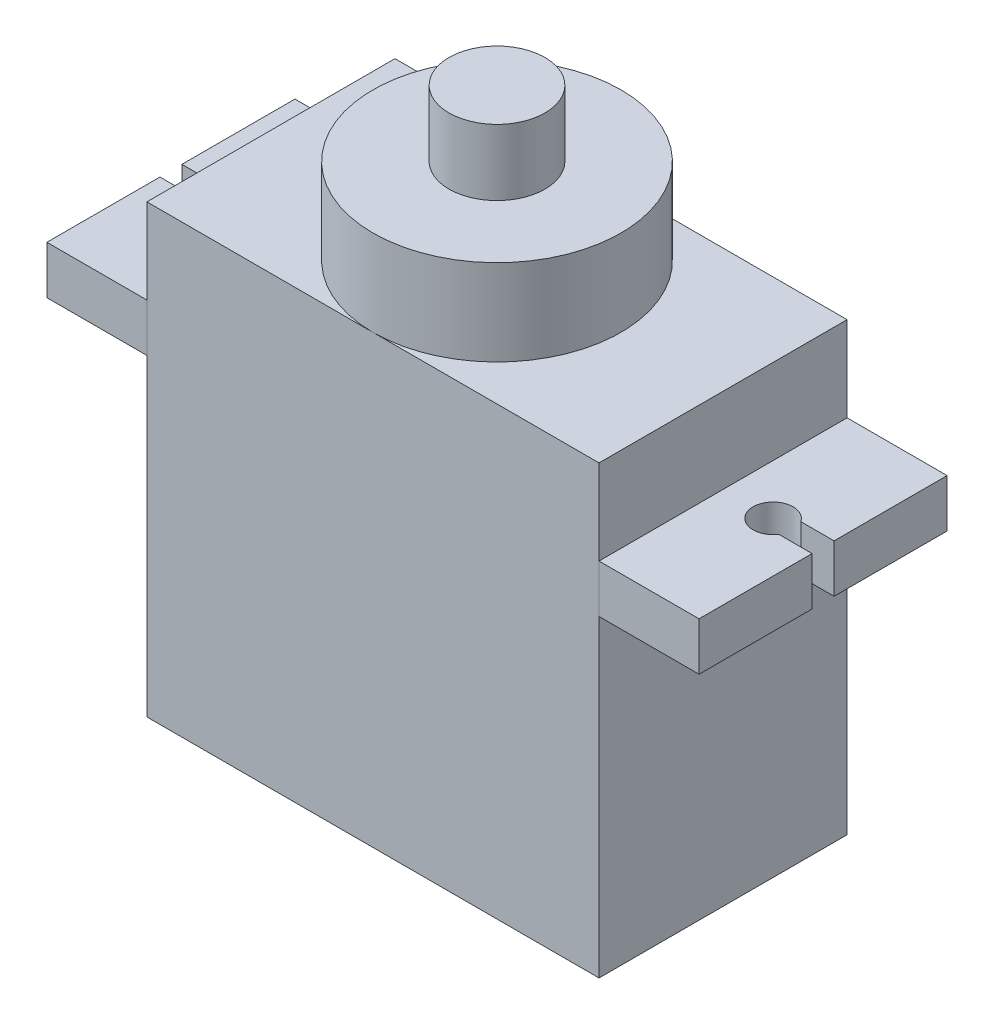
ISO-10303-21;
HEADER;
FILE_DESCRIPTION(('STEP AP214'),'2;1');
FILE_NAME('part.step','',(''),(''),'','','');
FILE_SCHEMA(('AUTOMOTIVE_DESIGN { 1 0 10303 214 1 1 1 1 }'));
ENDSEC;
DATA;
#1=APPLICATION_CONTEXT('core data for automotive mechanical design processes');
#2=APPLICATION_PROTOCOL_DEFINITION('international standard','automotive_design',2000,#1);
#3=PRODUCT_CONTEXT('',#1,'mechanical');
#4=PRODUCT('Part','Part','',(#3));
#5=PRODUCT_RELATED_PRODUCT_CATEGORY('part','',(#4));
#6=PRODUCT_DEFINITION_FORMATION('','',#4);
#7=PRODUCT_DEFINITION_CONTEXT('part definition',#1,'design');
#8=PRODUCT_DEFINITION('design','',#6,#7);
#9=PRODUCT_DEFINITION_SHAPE('','',#8);
#10=(LENGTH_UNIT() NAMED_UNIT(*) SI_UNIT(.MILLI.,.METRE.));
#11=(NAMED_UNIT(*) PLANE_ANGLE_UNIT() SI_UNIT($,.RADIAN.));
#12=(NAMED_UNIT(*) SI_UNIT($,.STERADIAN.) SOLID_ANGLE_UNIT());
#13=UNCERTAINTY_MEASURE_WITH_UNIT(LENGTH_MEASURE(1.E-05),#10,'distance_accuracy_value','');
#14=(GEOMETRIC_REPRESENTATION_CONTEXT(3) GLOBAL_UNCERTAINTY_ASSIGNED_CONTEXT((#13)) GLOBAL_UNIT_ASSIGNED_CONTEXT((#10,
#11,#12)) REPRESENTATION_CONTEXT('',''));
#15=CARTESIAN_POINT('',(0.,0.,0.));
#16=DIRECTION('',(0.,0.,1.));
#17=DIRECTION('',(1.,0.,0.));
#18=AXIS2_PLACEMENT_3D('',#15,#16,#17);
#19=CARTESIAN_POINT('',(-16.3,18.05,-6.2));
#20=DIRECTION('',(-1.,0.,0.));
#21=DIRECTION('',(0.,0.,1.));
#22=AXIS2_PLACEMENT_3D('',#19,#20,#21);
#23=PLANE('',#22);
#24=DIRECTION('',(0.,1.,0.));
#25=VECTOR('',#24,1.);
#26=CARTESIAN_POINT('',(-16.3,0.,0.550000000000012));
#27=LINE('',#26,#25);
#28=CARTESIAN_POINT('',(-16.3,15.65,0.550000000000012));
#29=VERTEX_POINT('',#28);
#30=CARTESIAN_POINT('',(-16.3,18.05,0.550000000000012));
#31=VERTEX_POINT('',#30);
#32=EDGE_CURVE('E148',#29,#31,#27,.T.);
#33=ORIENTED_EDGE('',*,*,#32,.F.);
#34=DIRECTION('',(0.,0.,1.));
#35=VECTOR('',#34,1.);
#36=CARTESIAN_POINT('',(-16.3,15.65,-6.2));
#37=LINE('',#36,#35);
#38=CARTESIAN_POINT('',(-16.3,15.65,6.2));
#39=VERTEX_POINT('',#38);
#40=EDGE_CURVE('E153',#29,#39,#37,.T.);
#41=ORIENTED_EDGE('',*,*,#40,.T.);
#42=DIRECTION('',(0.,-1.,0.));
#43=VECTOR('',#42,1.);
#44=CARTESIAN_POINT('',(-16.3,18.05,6.2));
#45=LINE('',#44,#43);
#46=CARTESIAN_POINT('',(-16.3,18.05,6.2));
#47=VERTEX_POINT('',#46);
#48=EDGE_CURVE('E161',#47,#39,#45,.T.);
#49=ORIENTED_EDGE('',*,*,#48,.F.);
#50=DIRECTION('',(0.,0.,1.));
#51=VECTOR('',#50,1.);
#52=CARTESIAN_POINT('',(-16.3,18.05,-6.2));
#53=LINE('',#52,#51);
#54=EDGE_CURVE('E154',#31,#47,#53,.T.);
#55=ORIENTED_EDGE('',*,*,#54,.F.);
#56=EDGE_LOOP('',(#33,#41,#49,#55));
#57=FACE_BOUND('',#56,.T.);
#58=ADVANCED_FACE('F60',(#57),#23,.T.);
#59=CARTESIAN_POINT('',(-11.3,18.05,-6.2));
#60=DIRECTION('',(1.,0.,0.));
#61=DIRECTION('',(0.,0.,-1.));
#62=AXIS2_PLACEMENT_3D('',#59,#60,#61);
#63=PLANE('',#62);
#64=DIRECTION('',(0.,1.,0.));
#65=VECTOR('',#64,1.);
#66=CARTESIAN_POINT('',(-11.3,18.05,6.2));
#67=LINE('',#66,#65);
#68=CARTESIAN_POINT('',(-11.3,15.65,6.2));
#69=VERTEX_POINT('',#68);
#70=CARTESIAN_POINT('',(-11.3,18.05,6.2));
#71=VERTEX_POINT('',#70);
#72=EDGE_CURVE('E167',#69,#71,#67,.T.);
#73=ORIENTED_EDGE('',*,*,#72,.F.);
#74=DIRECTION('',(0.,0.,1.));
#75=VECTOR('',#74,1.);
#76=CARTESIAN_POINT('',(-11.3,15.65,-6.2));
#77=LINE('',#76,#75);
#78=CARTESIAN_POINT('',(-11.3,15.65,-6.2));
#79=VERTEX_POINT('',#78);
#80=EDGE_CURVE('E12',#79,#69,#77,.T.);
#81=ORIENTED_EDGE('',*,*,#80,.F.);
#82=DIRECTION('',(0.,1.,0.));
#83=VECTOR('',#82,1.);
#84=CARTESIAN_POINT('',(-11.3,18.05,-6.2));
#85=LINE('',#84,#83);
#86=CARTESIAN_POINT('',(-11.3,18.05,-6.2));
#87=VERTEX_POINT('',#86);
#88=EDGE_CURVE('E160',#79,#87,#85,.T.);
#89=ORIENTED_EDGE('',*,*,#88,.T.);
#90=DIRECTION('',(0.,0.,1.));
#91=VECTOR('',#90,1.);
#92=CARTESIAN_POINT('',(-11.3,18.05,-6.2));
#93=LINE('',#92,#91);
#94=EDGE_CURVE('E64',#87,#71,#93,.T.);
#95=ORIENTED_EDGE('',*,*,#94,.T.);
#96=EDGE_LOOP('',(#73,#81,#89,#95));
#97=FACE_BOUND('',#96,.T.);
#98=ADVANCED_FACE('F62',(#97),#63,.T.);
#99=CARTESIAN_POINT('',(-11.3,15.65,-6.2));
#100=DIRECTION('',(0.,-1.,0.));
#101=DIRECTION('',(0.,0.,-1.));
#102=AXIS2_PLACEMENT_3D('',#99,#100,#101);
#103=PLANE('',#102);
#104=DIRECTION('',(-1.,0.,0.));
#105=VECTOR('',#104,1.);
#106=CARTESIAN_POINT('',(-11.3,15.65,0.55000000000001));
#107=LINE('',#106,#105);
#108=CARTESIAN_POINT('',(-14.6351646544245,15.65,0.550000000000011));
#109=VERTEX_POINT('',#108);
#110=EDGE_CURVE('E178',#109,#29,#107,.T.);
#111=ORIENTED_EDGE('',*,*,#110,.F.);
#112=CARTESIAN_POINT('',(-13.8,15.65,0.));
#113=DIRECTION('',(0.,-1.,0.));
#114=DIRECTION('',(0.,0.,-1.));
#115=AXIS2_PLACEMENT_3D('',#112,#113,#114);
#116=CIRCLE('',#115,1.);
#117=CARTESIAN_POINT('',(-14.6351646544245,15.65,-0.550000000000004));
#118=VERTEX_POINT('',#117);
#119=EDGE_CURVE('E170',#118,#109,#116,.T.);
#120=ORIENTED_EDGE('',*,*,#119,.F.);
#121=DIRECTION('',(1.,0.,0.));
#122=VECTOR('',#121,1.);
#123=CARTESIAN_POINT('',(-11.3,15.65,-0.550000000000004));
#124=LINE('',#123,#122);
#125=CARTESIAN_POINT('',(-16.3,15.65,-0.550000000000004));
#126=VERTEX_POINT('',#125);
#127=EDGE_CURVE('E180',#126,#118,#124,.T.);
#128=ORIENTED_EDGE('',*,*,#127,.F.);
#129=CARTESIAN_POINT('',(-16.3,15.65,-6.2));
#130=VERTEX_POINT('',#129);
#131=EDGE_CURVE('E69',#130,#126,#37,.T.);
#132=ORIENTED_EDGE('',*,*,#131,.F.);
#133=DIRECTION('',(1.,0.,0.));
#134=VECTOR('',#133,1.);
#135=CARTESIAN_POINT('',(-11.3,15.65,-6.2));
#136=LINE('',#135,#134);
#137=EDGE_CURVE('E171',#130,#79,#136,.T.);
#138=ORIENTED_EDGE('',*,*,#137,.T.);
#139=ORIENTED_EDGE('',*,*,#80,.T.);
#140=DIRECTION('',(1.,0.,0.));
#141=VECTOR('',#140,1.);
#142=CARTESIAN_POINT('',(-11.3,15.65,6.2));
#143=LINE('',#142,#141);
#144=EDGE_CURVE('E157',#39,#69,#143,.T.);
#145=ORIENTED_EDGE('',*,*,#144,.F.);
#146=ORIENTED_EDGE('',*,*,#40,.F.);
#147=EDGE_LOOP('',(#111,#120,#128,#132,#138,#139,#145,#146));
#148=FACE_BOUND('',#147,.T.);
#149=ADVANCED_FACE('F202',(#148),#103,.T.);
#150=DIRECTION('',(0.,1.,0.));
#151=VECTOR('',#150,1.);
#152=CARTESIAN_POINT('',(-16.3,0.,-0.550000000000004));
#153=LINE('',#152,#151);
#154=CARTESIAN_POINT('',(-16.3,18.05,-0.550000000000004));
#155=VERTEX_POINT('',#154);
#156=EDGE_CURVE('E136',#126,#155,#153,.T.);
#157=ORIENTED_EDGE('',*,*,#156,.T.);
#158=CARTESIAN_POINT('',(-16.3,18.05,-6.2));
#159=VERTEX_POINT('',#158);
#160=EDGE_CURVE('E146',#159,#155,#53,.T.);
#161=ORIENTED_EDGE('',*,*,#160,.F.);
#162=DIRECTION('',(0.,-1.,0.));
#163=VECTOR('',#162,1.);
#164=CARTESIAN_POINT('',(-16.3,18.05,-6.2));
#165=LINE('',#164,#163);
#166=EDGE_CURVE('E173',#159,#130,#165,.T.);
#167=ORIENTED_EDGE('',*,*,#166,.T.);
#168=ORIENTED_EDGE('',*,*,#131,.T.);
#169=EDGE_LOOP('',(#157,#161,#167,#168));
#170=FACE_BOUND('',#169,.T.);
#171=ADVANCED_FACE('F144',(#170),#23,.T.);
#172=CARTESIAN_POINT('',(-11.3,18.05,-6.2));
#173=DIRECTION('',(0.,1.,0.));
#174=DIRECTION('',(0.,0.,1.));
#175=AXIS2_PLACEMENT_3D('',#172,#173,#174);
#176=PLANE('',#175);
#177=DIRECTION('',(1.,0.,0.));
#178=VECTOR('',#177,1.);
#179=CARTESIAN_POINT('',(-14.6351646544245,18.05,0.550000000000011));
#180=LINE('',#179,#178);
#181=CARTESIAN_POINT('',(-14.6351646544245,18.05,0.550000000000011));
#182=VERTEX_POINT('',#181);
#183=EDGE_CURVE('E140',#31,#182,#180,.T.);
#184=ORIENTED_EDGE('',*,*,#183,.F.);
#185=ORIENTED_EDGE('',*,*,#54,.T.);
#186=DIRECTION('',(-1.,0.,0.));
#187=VECTOR('',#186,1.);
#188=CARTESIAN_POINT('',(-11.3,18.05,6.2));
#189=LINE('',#188,#187);
#190=EDGE_CURVE('E164',#71,#47,#189,.T.);
#191=ORIENTED_EDGE('',*,*,#190,.F.);
#192=ORIENTED_EDGE('',*,*,#94,.F.);
#193=DIRECTION('',(-1.,0.,0.));
#194=VECTOR('',#193,1.);
#195=CARTESIAN_POINT('',(-11.3,18.05,-6.2));
#196=LINE('',#195,#194);
#197=EDGE_CURVE('E152',#87,#159,#196,.T.);
#198=ORIENTED_EDGE('',*,*,#197,.T.);
#199=ORIENTED_EDGE('',*,*,#160,.T.);
#200=DIRECTION('',(-1.,0.,0.));
#201=VECTOR('',#200,1.);
#202=CARTESIAN_POINT('',(-16.3,18.05,-0.550000000000004));
#203=LINE('',#202,#201);
#204=CARTESIAN_POINT('',(-14.6351646544245,18.05,-0.550000000000004));
#205=VERTEX_POINT('',#204);
#206=EDGE_CURVE('E133',#205,#155,#203,.T.);
#207=ORIENTED_EDGE('',*,*,#206,.F.);
#208=CARTESIAN_POINT('',(-13.8,18.05,0.));
#209=DIRECTION('',(0.,1.,0.));
#210=DIRECTION('',(0.,0.,-1.));
#211=AXIS2_PLACEMENT_3D('',#208,#209,#210);
#212=CIRCLE('',#211,1.);
#213=EDGE_CURVE('E77',#182,#205,#212,.T.);
#214=ORIENTED_EDGE('',*,*,#213,.F.);
#215=EDGE_LOOP('',(#184,#185,#191,#192,#198,#199,#207,#214));
#216=FACE_BOUND('',#215,.T.);
#217=ADVANCED_FACE('F151',(#216),#176,.T.);
#218=CARTESIAN_POINT('',(0.,0.,-6.2));
#219=DIRECTION('',(0.,0.,-1.));
#220=DIRECTION('',(-1.,0.,0.));
#221=AXIS2_PLACEMENT_3D('',#218,#219,#220);
#222=PLANE('',#221);
#223=ORIENTED_EDGE('',*,*,#88,.F.);
#224=ORIENTED_EDGE('',*,*,#137,.F.);
#225=ORIENTED_EDGE('',*,*,#166,.F.);
#226=ORIENTED_EDGE('',*,*,#197,.F.);
#227=EDGE_LOOP('',(#223,#224,#225,#226));
#228=FACE_BOUND('',#227,.T.);
#229=ADVANCED_FACE('F201',(#228),#222,.T.);
#230=CARTESIAN_POINT('',(0.,0.,6.2));
#231=DIRECTION('',(0.,0.,-1.));
#232=DIRECTION('',(-1.,0.,0.));
#233=AXIS2_PLACEMENT_3D('',#230,#231,#232);
#234=PLANE('',#233);
#235=ORIENTED_EDGE('',*,*,#72,.T.);
#236=ORIENTED_EDGE('',*,*,#190,.T.);
#237=ORIENTED_EDGE('',*,*,#48,.T.);
#238=ORIENTED_EDGE('',*,*,#144,.T.);
#239=EDGE_LOOP('',(#235,#236,#237,#238));
#240=FACE_BOUND('',#239,.T.);
#241=ADVANCED_FACE('F198',(#240),#234,.F.);
#242=CARTESIAN_POINT('',(-13.8,0.,0.));
#243=DIRECTION('',(0.,1.,0.));
#244=DIRECTION('',(0.,0.,1.));
#245=AXIS2_PLACEMENT_3D('',#242,#243,#244);
#246=CYLINDRICAL_SURFACE('',#245,1.);
#247=ORIENTED_EDGE('',*,*,#119,.T.);
#248=DIRECTION('',(0.,1.,0.));
#249=VECTOR('',#248,1.);
#250=CARTESIAN_POINT('',(-14.6351646544245,0.,0.550000000000011));
#251=LINE('',#250,#249);
#252=EDGE_CURVE('E182',#109,#182,#251,.T.);
#253=ORIENTED_EDGE('',*,*,#252,.T.);
#254=ORIENTED_EDGE('',*,*,#213,.T.);
#255=DIRECTION('',(0.,1.,0.));
#256=VECTOR('',#255,1.);
#257=CARTESIAN_POINT('',(-14.6351646544245,0.,-0.550000000000004));
#258=LINE('',#257,#256);
#259=EDGE_CURVE('E138',#118,#205,#258,.T.);
#260=ORIENTED_EDGE('',*,*,#259,.F.);
#261=EDGE_LOOP('',(#247,#253,#254,#260));
#262=FACE_BOUND('',#261,.T.);
#263=ADVANCED_FACE('F204',(#262),#246,.F.);
#264=CARTESIAN_POINT('',(-14.6351646544245,0.,0.550000000000011));
#265=DIRECTION('',(0.,0.,1.));
#266=DIRECTION('',(1.,0.,0.));
#267=AXIS2_PLACEMENT_3D('',#264,#265,#266);
#268=PLANE('',#267);
#269=ORIENTED_EDGE('',*,*,#110,.T.);
#270=ORIENTED_EDGE('',*,*,#32,.T.);
#271=ORIENTED_EDGE('',*,*,#183,.T.);
#272=ORIENTED_EDGE('',*,*,#252,.F.);
#273=EDGE_LOOP('',(#269,#270,#271,#272));
#274=FACE_BOUND('',#273,.T.);
#275=ADVANCED_FACE('F190',(#274),#268,.F.);
#276=CARTESIAN_POINT('',(-16.3,0.,-0.550000000000004));
#277=DIRECTION('',(0.,0.,-1.));
#278=DIRECTION('',(-1.,0.,0.));
#279=AXIS2_PLACEMENT_3D('',#276,#277,#278);
#280=PLANE('',#279);
#281=ORIENTED_EDGE('',*,*,#127,.T.);
#282=ORIENTED_EDGE('',*,*,#259,.T.);
#283=ORIENTED_EDGE('',*,*,#206,.T.);
#284=ORIENTED_EDGE('',*,*,#156,.F.);
#285=EDGE_LOOP('',(#281,#282,#283,#284));
#286=FACE_BOUND('',#285,.T.);
#287=ADVANCED_FACE('F135',(#286),#280,.F.);
#288=CLOSED_SHELL('',(#58,#98,#149,#171,#217,#229,#241,#263,#275,#287));
#289=MANIFOLD_SOLID_BREP('B2',#288);
#290=CARTESIAN_POINT('',(16.3,18.05,-6.2));
#291=DIRECTION('',(1.,0.,0.));
#292=DIRECTION('',(0.,0.,-1.));
#293=AXIS2_PLACEMENT_3D('',#290,#291,#292);
#294=PLANE('',#293);
#295=DIRECTION('',(0.,1.,0.));
#296=VECTOR('',#295,1.);
#297=CARTESIAN_POINT('',(16.3,0.,-0.550000000000004));
#298=LINE('',#297,#296);
#299=CARTESIAN_POINT('',(16.3,15.65,-0.550000000000004));
#300=VERTEX_POINT('',#299);
#301=CARTESIAN_POINT('',(16.3,18.05,-0.550000000000004));
#302=VERTEX_POINT('',#301);
#303=EDGE_CURVE('E391',#300,#302,#298,.T.);
#304=ORIENTED_EDGE('',*,*,#303,.F.);
#305=DIRECTION('',(0.,0.,1.));
#306=VECTOR('',#305,1.);
#307=CARTESIAN_POINT('',(16.3,15.65,-6.2));
#308=LINE('',#307,#306);
#309=CARTESIAN_POINT('',(16.3,15.65,-6.2));
#310=VERTEX_POINT('',#309);
#311=EDGE_CURVE('E418',#310,#300,#308,.T.);
#312=ORIENTED_EDGE('',*,*,#311,.F.);
#313=DIRECTION('',(0.,1.,0.));
#314=VECTOR('',#313,1.);
#315=CARTESIAN_POINT('',(16.3,18.05,-6.2));
#316=LINE('',#315,#314);
#317=CARTESIAN_POINT('',(16.3,18.05,-6.2));
#318=VERTEX_POINT('',#317);
#319=EDGE_CURVE('E399',#310,#318,#316,.T.);
#320=ORIENTED_EDGE('',*,*,#319,.T.);
#321=DIRECTION('',(0.,0.,1.));
#322=VECTOR('',#321,1.);
#323=CARTESIAN_POINT('',(16.3,18.05,-6.2));
#324=LINE('',#323,#322);
#325=EDGE_CURVE('E415',#318,#302,#324,.T.);
#326=ORIENTED_EDGE('',*,*,#325,.T.);
#327=EDGE_LOOP('',(#304,#312,#320,#326));
#328=FACE_BOUND('',#327,.T.);
#329=ADVANCED_FACE('F294',(#328),#294,.T.);
#330=CARTESIAN_POINT('',(11.3,18.05,-6.2));
#331=DIRECTION('',(-1.,0.,0.));
#332=DIRECTION('',(0.,0.,1.));
#333=AXIS2_PLACEMENT_3D('',#330,#331,#332);
#334=PLANE('',#333);
#335=DIRECTION('',(0.,-1.,0.));
#336=VECTOR('',#335,1.);
#337=CARTESIAN_POINT('',(11.3,18.05,6.2));
#338=LINE('',#337,#336);
#339=CARTESIAN_POINT('',(11.3,18.05,6.2));
#340=VERTEX_POINT('',#339);
#341=CARTESIAN_POINT('',(11.3,15.65,6.2));
#342=VERTEX_POINT('',#341);
#343=EDGE_CURVE('E390',#340,#342,#338,.T.);
#344=ORIENTED_EDGE('',*,*,#343,.F.);
#345=DIRECTION('',(0.,0.,1.));
#346=VECTOR('',#345,1.);
#347=CARTESIAN_POINT('',(11.3,18.05,-6.2));
#348=LINE('',#347,#346);
#349=CARTESIAN_POINT('',(11.3,18.05,-6.2));
#350=VERTEX_POINT('',#349);
#351=EDGE_CURVE('E318',#350,#340,#348,.T.);
#352=ORIENTED_EDGE('',*,*,#351,.F.);
#353=DIRECTION('',(0.,-1.,0.));
#354=VECTOR('',#353,1.);
#355=CARTESIAN_POINT('',(11.3,18.05,-6.2));
#356=LINE('',#355,#354);
#357=CARTESIAN_POINT('',(11.3,15.65,-6.2));
#358=VERTEX_POINT('',#357);
#359=EDGE_CURVE('E394',#350,#358,#356,.T.);
#360=ORIENTED_EDGE('',*,*,#359,.T.);
#361=DIRECTION('',(0.,0.,1.));
#362=VECTOR('',#361,1.);
#363=CARTESIAN_POINT('',(11.3,15.65,-6.2));
#364=LINE('',#363,#362);
#365=EDGE_CURVE('E344',#358,#342,#364,.T.);
#366=ORIENTED_EDGE('',*,*,#365,.T.);
#367=EDGE_LOOP('',(#344,#352,#360,#366));
#368=FACE_BOUND('',#367,.T.);
#369=ADVANCED_FACE('F296',(#368),#334,.T.);
#370=CARTESIAN_POINT('',(11.3,18.05,-6.2));
#371=DIRECTION('',(0.,1.,0.));
#372=DIRECTION('',(0.,0.,1.));
#373=AXIS2_PLACEMENT_3D('',#370,#371,#372);
#374=PLANE('',#373);
#375=DIRECTION('',(-1.,0.,0.));
#376=VECTOR('',#375,1.);
#377=CARTESIAN_POINT('',(14.6351646544245,18.05,-0.550000000000004));
#378=LINE('',#377,#376);
#379=CARTESIAN_POINT('',(14.6351646544245,18.05,-0.550000000000004));
#380=VERTEX_POINT('',#379);
#381=EDGE_CURVE('E373',#302,#380,#378,.T.);
#382=ORIENTED_EDGE('',*,*,#381,.F.);
#383=ORIENTED_EDGE('',*,*,#325,.F.);
#384=DIRECTION('',(-1.,0.,0.));
#385=VECTOR('',#384,1.);
#386=CARTESIAN_POINT('',(11.3,18.05,-6.2));
#387=LINE('',#386,#385);
#388=EDGE_CURVE('E402',#318,#350,#387,.T.);
#389=ORIENTED_EDGE('',*,*,#388,.T.);
#390=ORIENTED_EDGE('',*,*,#351,.T.);
#391=DIRECTION('',(-1.,0.,0.));
#392=VECTOR('',#391,1.);
#393=CARTESIAN_POINT('',(11.3,18.05,6.2));
#394=LINE('',#393,#392);
#395=CARTESIAN_POINT('',(16.3,18.05,6.2));
#396=VERTEX_POINT('',#395);
#397=EDGE_CURVE('E397',#396,#340,#394,.T.);
#398=ORIENTED_EDGE('',*,*,#397,.F.);
#399=CARTESIAN_POINT('',(16.3,18.05,0.549999999999996));
#400=VERTEX_POINT('',#399);
#401=EDGE_CURVE('E385',#400,#396,#324,.T.);
#402=ORIENTED_EDGE('',*,*,#401,.F.);
#403=DIRECTION('',(1.,0.,0.));
#404=VECTOR('',#403,1.);
#405=CARTESIAN_POINT('',(16.3,18.05,0.549999999999996));
#406=LINE('',#405,#404);
#407=CARTESIAN_POINT('',(14.6351646544245,18.05,0.549999999999997));
#408=VERTEX_POINT('',#407);
#409=EDGE_CURVE('E369',#408,#400,#406,.T.);
#410=ORIENTED_EDGE('',*,*,#409,.F.);
#411=CARTESIAN_POINT('',(13.8,18.05,0.));
#412=DIRECTION('',(0.,1.,0.));
#413=DIRECTION('',(0.,0.,1.));
#414=AXIS2_PLACEMENT_3D('',#411,#412,#413);
#415=CIRCLE('',#414,1.);
#416=EDGE_CURVE('E376',#380,#408,#415,.T.);
#417=ORIENTED_EDGE('',*,*,#416,.F.);
#418=EDGE_LOOP('',(#382,#383,#389,#390,#398,#402,#410,#417));
#419=FACE_BOUND('',#418,.T.);
#420=ADVANCED_FACE('F384',(#419),#374,.T.);
#421=DIRECTION('',(0.,1.,0.));
#422=VECTOR('',#421,1.);
#423=CARTESIAN_POINT('',(16.3,0.,0.549999999999996));
#424=LINE('',#423,#422);
#425=CARTESIAN_POINT('',(16.3,15.65,0.549999999999994));
#426=VERTEX_POINT('',#425);
#427=EDGE_CURVE('E309',#426,#400,#424,.T.);
#428=ORIENTED_EDGE('',*,*,#427,.T.);
#429=ORIENTED_EDGE('',*,*,#401,.T.);
#430=DIRECTION('',(0.,1.,0.));
#431=VECTOR('',#430,1.);
#432=CARTESIAN_POINT('',(16.3,18.05,6.2));
#433=LINE('',#432,#431);
#434=CARTESIAN_POINT('',(16.3,15.65,6.2));
#435=VERTEX_POINT('',#434);
#436=EDGE_CURVE('E409',#435,#396,#433,.T.);
#437=ORIENTED_EDGE('',*,*,#436,.F.);
#438=EDGE_CURVE('E421',#426,#435,#308,.T.);
#439=ORIENTED_EDGE('',*,*,#438,.F.);
#440=EDGE_LOOP('',(#428,#429,#437,#439));
#441=FACE_BOUND('',#440,.T.);
#442=ADVANCED_FACE('F438',(#441),#294,.T.);
#443=CARTESIAN_POINT('',(11.3,15.65,-6.2));
#444=DIRECTION('',(0.,-1.,0.));
#445=DIRECTION('',(0.,0.,-1.));
#446=AXIS2_PLACEMENT_3D('',#443,#444,#445);
#447=PLANE('',#446);
#448=DIRECTION('',(1.,0.,0.));
#449=VECTOR('',#448,1.);
#450=CARTESIAN_POINT('',(11.3,15.65,-0.550000000000004));
#451=LINE('',#450,#449);
#452=CARTESIAN_POINT('',(14.6351646544245,15.65,-0.550000000000004));
#453=VERTEX_POINT('',#452);
#454=EDGE_CURVE('E58',#453,#300,#451,.T.);
#455=ORIENTED_EDGE('',*,*,#454,.F.);
#456=CARTESIAN_POINT('',(13.8,15.65,0.));
#457=DIRECTION('',(0.,-1.,0.));
#458=DIRECTION('',(0.,0.,-1.));
#459=AXIS2_PLACEMENT_3D('',#456,#457,#458);
#460=CIRCLE('',#459,1.);
#461=CARTESIAN_POINT('',(14.6351646544245,15.65,0.549999999999997));
#462=VERTEX_POINT('',#461);
#463=EDGE_CURVE('E302',#462,#453,#460,.T.);
#464=ORIENTED_EDGE('',*,*,#463,.F.);
#465=DIRECTION('',(-1.,0.,0.));
#466=VECTOR('',#465,1.);
#467=CARTESIAN_POINT('',(11.3,15.65,0.549999999999998));
#468=LINE('',#467,#466);
#469=EDGE_CURVE('E370',#426,#462,#468,.T.);
#470=ORIENTED_EDGE('',*,*,#469,.F.);
#471=ORIENTED_EDGE('',*,*,#438,.T.);
#472=DIRECTION('',(1.,0.,0.));
#473=VECTOR('',#472,1.);
#474=CARTESIAN_POINT('',(11.3,15.65,6.2));
#475=LINE('',#474,#473);
#476=EDGE_CURVE('E406',#342,#435,#475,.T.);
#477=ORIENTED_EDGE('',*,*,#476,.F.);
#478=ORIENTED_EDGE('',*,*,#365,.F.);
#479=DIRECTION('',(1.,0.,0.));
#480=VECTOR('',#479,1.);
#481=CARTESIAN_POINT('',(11.3,15.65,-6.2));
#482=LINE('',#481,#480);
#483=EDGE_CURVE('E396',#358,#310,#482,.T.);
#484=ORIENTED_EDGE('',*,*,#483,.T.);
#485=ORIENTED_EDGE('',*,*,#311,.T.);
#486=EDGE_LOOP('',(#455,#464,#470,#471,#477,#478,#484,#485));
#487=FACE_BOUND('',#486,.T.);
#488=ADVANCED_FACE('F427',(#487),#447,.T.);
#489=CARTESIAN_POINT('',(0.,0.,-6.2));
#490=DIRECTION('',(0.,0.,1.));
#491=DIRECTION('',(1.,0.,0.));
#492=AXIS2_PLACEMENT_3D('',#489,#490,#491);
#493=PLANE('',#492);
#494=ORIENTED_EDGE('',*,*,#359,.F.);
#495=ORIENTED_EDGE('',*,*,#388,.F.);
#496=ORIENTED_EDGE('',*,*,#319,.F.);
#497=ORIENTED_EDGE('',*,*,#483,.F.);
#498=EDGE_LOOP('',(#494,#495,#496,#497));
#499=FACE_BOUND('',#498,.T.);
#500=ADVANCED_FACE('F432',(#499),#493,.F.);
#501=CARTESIAN_POINT('',(0.,0.,6.2));
#502=DIRECTION('',(0.,0.,1.));
#503=DIRECTION('',(1.,0.,0.));
#504=AXIS2_PLACEMENT_3D('',#501,#502,#503);
#505=PLANE('',#504);
#506=ORIENTED_EDGE('',*,*,#343,.T.);
#507=ORIENTED_EDGE('',*,*,#476,.T.);
#508=ORIENTED_EDGE('',*,*,#436,.T.);
#509=ORIENTED_EDGE('',*,*,#397,.T.);
#510=EDGE_LOOP('',(#506,#507,#508,#509));
#511=FACE_BOUND('',#510,.T.);
#512=ADVANCED_FACE('F436',(#511),#505,.T.);
#513=CARTESIAN_POINT('',(13.8,0.,0.));
#514=DIRECTION('',(0.,1.,0.));
#515=DIRECTION('',(0.,0.,1.));
#516=AXIS2_PLACEMENT_3D('',#513,#514,#515);
#517=CYLINDRICAL_SURFACE('',#516,1.);
#518=ORIENTED_EDGE('',*,*,#463,.T.);
#519=DIRECTION('',(0.,1.,0.));
#520=VECTOR('',#519,1.);
#521=CARTESIAN_POINT('',(14.6351646544245,0.,-0.550000000000004));
#522=LINE('',#521,#520);
#523=EDGE_CURVE('E379',#453,#380,#522,.T.);
#524=ORIENTED_EDGE('',*,*,#523,.T.);
#525=ORIENTED_EDGE('',*,*,#416,.T.);
#526=DIRECTION('',(0.,1.,0.));
#527=VECTOR('',#526,1.);
#528=CARTESIAN_POINT('',(14.6351646544245,0.,0.549999999999997));
#529=LINE('',#528,#527);
#530=EDGE_CURVE('E365',#462,#408,#529,.T.);
#531=ORIENTED_EDGE('',*,*,#530,.F.);
#532=EDGE_LOOP('',(#518,#524,#525,#531));
#533=FACE_BOUND('',#532,.T.);
#534=ADVANCED_FACE('F377',(#533),#517,.F.);
#535=CARTESIAN_POINT('',(14.6351646544245,0.,-0.550000000000004));
#536=DIRECTION('',(0.,0.,-1.));
#537=DIRECTION('',(-1.,0.,0.));
#538=AXIS2_PLACEMENT_3D('',#535,#536,#537);
#539=PLANE('',#538);
#540=ORIENTED_EDGE('',*,*,#454,.T.);
#541=ORIENTED_EDGE('',*,*,#303,.T.);
#542=ORIENTED_EDGE('',*,*,#381,.T.);
#543=ORIENTED_EDGE('',*,*,#523,.F.);
#544=EDGE_LOOP('',(#540,#541,#542,#543));
#545=FACE_BOUND('',#544,.T.);
#546=ADVANCED_FACE('F425',(#545),#539,.F.);
#547=CARTESIAN_POINT('',(16.3,0.,0.549999999999996));
#548=DIRECTION('',(0.,0.,1.));
#549=DIRECTION('',(1.,0.,0.));
#550=AXIS2_PLACEMENT_3D('',#547,#548,#549);
#551=PLANE('',#550);
#552=ORIENTED_EDGE('',*,*,#469,.T.);
#553=ORIENTED_EDGE('',*,*,#530,.T.);
#554=ORIENTED_EDGE('',*,*,#409,.T.);
#555=ORIENTED_EDGE('',*,*,#427,.F.);
#556=EDGE_LOOP('',(#552,#553,#554,#555));
#557=FACE_BOUND('',#556,.T.);
#558=ADVANCED_FACE('F367',(#557),#551,.F.);
#559=CLOSED_SHELL('',(#329,#369,#420,#442,#488,#500,#512,#534,#546,#558));
#560=MANIFOLD_SOLID_BREP('B6',#559);
#561=CARTESIAN_POINT('',(0.,22.3,0.));
#562=DIRECTION('',(0.,1.,0.));
#563=DIRECTION('',(0.,0.,1.));
#564=AXIS2_PLACEMENT_3D('',#561,#562,#563);
#565=PLANE('',#564);
#566=CARTESIAN_POINT('',(0.,22.3,0.));
#567=DIRECTION('',(0.,1.,0.));
#568=DIRECTION('',(0.,0.,1.));
#569=AXIS2_PLACEMENT_3D('',#566,#567,#568);
#570=CIRCLE('',#569,6.2);
#571=CARTESIAN_POINT('',(0.,22.3,6.2));
#572=VERTEX_POINT('',#571);
#573=CARTESIAN_POINT('',(0.,22.3,-6.2));
#574=VERTEX_POINT('',#573);
#575=EDGE_CURVE('E586',#572,#574,#570,.T.);
#576=ORIENTED_EDGE('',*,*,#575,.F.);
#577=DIRECTION('',(1.,0.,0.));
#578=VECTOR('',#577,1.);
#579=CARTESIAN_POINT('',(-11.3,22.3,6.2));
#580=LINE('',#579,#578);
#581=CARTESIAN_POINT('',(11.3,22.3,6.2));
#582=VERTEX_POINT('',#581);
#583=EDGE_CURVE('E544',#572,#582,#580,.T.);
#584=ORIENTED_EDGE('',*,*,#583,.T.);
#585=DIRECTION('',(0.,0.,-1.));
#586=VECTOR('',#585,1.);
#587=CARTESIAN_POINT('',(11.3,22.3,-6.2));
#588=LINE('',#587,#586);
#589=CARTESIAN_POINT('',(11.3,22.3,-6.2));
#590=VERTEX_POINT('',#589);
#591=EDGE_CURVE('E595',#582,#590,#588,.T.);
#592=ORIENTED_EDGE('',*,*,#591,.T.);
#593=DIRECTION('',(-1.,0.,0.));
#594=VECTOR('',#593,1.);
#595=CARTESIAN_POINT('',(-11.3,22.3,-6.2));
#596=LINE('',#595,#594);
#597=EDGE_CURVE('E573',#590,#574,#596,.T.);
#598=ORIENTED_EDGE('',*,*,#597,.T.);
#599=EDGE_LOOP('',(#576,#584,#592,#598));
#600=FACE_BOUND('',#599,.T.);
#601=ADVANCED_FACE('F519',(#600),#565,.T.);
#602=CARTESIAN_POINT('',(11.3,22.3,-6.2));
#603=DIRECTION('',(-1.,0.,0.));
#604=DIRECTION('',(0.,0.,1.));
#605=AXIS2_PLACEMENT_3D('',#602,#603,#604);
#606=PLANE('',#605);
#607=DIRECTION('',(0.,0.,-1.));
#608=VECTOR('',#607,1.);
#609=CARTESIAN_POINT('',(11.3,0.,-6.2));
#610=LINE('',#609,#608);
#611=CARTESIAN_POINT('',(11.3,0.,6.2));
#612=VERTEX_POINT('',#611);
#613=CARTESIAN_POINT('',(11.3,0.,-6.2));
#614=VERTEX_POINT('',#613);
#615=EDGE_CURVE('E600',#612,#614,#610,.T.);
#616=ORIENTED_EDGE('',*,*,#615,.T.);
#617=DIRECTION('',(0.,-1.,0.));
#618=VECTOR('',#617,1.);
#619=CARTESIAN_POINT('',(11.3,22.3,-6.2));
#620=LINE('',#619,#618);
#621=EDGE_CURVE('E523',#590,#614,#620,.T.);
#622=ORIENTED_EDGE('',*,*,#621,.F.);
#623=ORIENTED_EDGE('',*,*,#591,.F.);
#624=DIRECTION('',(0.,-1.,0.));
#625=VECTOR('',#624,1.);
#626=CARTESIAN_POINT('',(11.3,22.3,6.2));
#627=LINE('',#626,#625);
#628=EDGE_CURVE('E581',#582,#612,#627,.T.);
#629=ORIENTED_EDGE('',*,*,#628,.T.);
#630=EDGE_LOOP('',(#616,#622,#623,#629));
#631=FACE_BOUND('',#630,.T.);
#632=ADVANCED_FACE('F521',(#631),#606,.F.);
#633=CARTESIAN_POINT('',(-11.3,22.3,-6.2));
#634=DIRECTION('',(0.,0.,1.));
#635=DIRECTION('',(1.,0.,0.));
#636=AXIS2_PLACEMENT_3D('',#633,#634,#635);
#637=PLANE('',#636);
#638=DIRECTION('',(-1.,0.,0.));
#639=VECTOR('',#638,1.);
#640=CARTESIAN_POINT('',(-11.3,0.,-6.2));
#641=LINE('',#640,#639);
#642=CARTESIAN_POINT('',(-11.3,0.,-6.2));
#643=VERTEX_POINT('',#642);
#644=EDGE_CURVE('E603',#614,#643,#641,.T.);
#645=ORIENTED_EDGE('',*,*,#644,.T.);
#646=DIRECTION('',(0.,-1.,0.));
#647=VECTOR('',#646,1.);
#648=CARTESIAN_POINT('',(-11.3,22.3,-6.2));
#649=LINE('',#648,#647);
#650=CARTESIAN_POINT('',(-11.3,22.3,-6.2));
#651=VERTEX_POINT('',#650);
#652=EDGE_CURVE('E592',#651,#643,#649,.T.);
#653=ORIENTED_EDGE('',*,*,#652,.F.);
#654=EDGE_CURVE('E597',#574,#651,#596,.T.);
#655=ORIENTED_EDGE('',*,*,#654,.F.);
#656=ORIENTED_EDGE('',*,*,#597,.F.);
#657=ORIENTED_EDGE('',*,*,#621,.T.);
#658=EDGE_LOOP('',(#645,#653,#655,#656,#657));
#659=FACE_BOUND('',#658,.T.);
#660=ADVANCED_FACE('F620',(#659),#637,.F.);
#661=CARTESIAN_POINT('',(-11.3,22.3,-6.2));
#662=DIRECTION('',(1.,0.,0.));
#663=DIRECTION('',(0.,0.,-1.));
#664=AXIS2_PLACEMENT_3D('',#661,#662,#663);
#665=PLANE('',#664);
#666=DIRECTION('',(0.,0.,1.));
#667=VECTOR('',#666,1.);
#668=CARTESIAN_POINT('',(-11.3,0.,-6.2));
#669=LINE('',#668,#667);
#670=CARTESIAN_POINT('',(-11.3,0.,6.2));
#671=VERTEX_POINT('',#670);
#672=EDGE_CURVE('E605',#643,#671,#669,.T.);
#673=ORIENTED_EDGE('',*,*,#672,.T.);
#674=DIRECTION('',(0.,-1.,0.));
#675=VECTOR('',#674,1.);
#676=CARTESIAN_POINT('',(-11.3,22.3,6.2));
#677=LINE('',#676,#675);
#678=CARTESIAN_POINT('',(-11.3,22.3,6.2));
#679=VERTEX_POINT('',#678);
#680=EDGE_CURVE('E609',#679,#671,#677,.T.);
#681=ORIENTED_EDGE('',*,*,#680,.F.);
#682=DIRECTION('',(0.,0.,1.));
#683=VECTOR('',#682,1.);
#684=CARTESIAN_POINT('',(-11.3,22.3,-6.2));
#685=LINE('',#684,#683);
#686=EDGE_CURVE('E579',#651,#679,#685,.T.);
#687=ORIENTED_EDGE('',*,*,#686,.F.);
#688=ORIENTED_EDGE('',*,*,#652,.T.);
#689=EDGE_LOOP('',(#673,#681,#687,#688));
#690=FACE_BOUND('',#689,.T.);
#691=ADVANCED_FACE('F614',(#690),#665,.F.);
#692=CARTESIAN_POINT('',(-11.3,22.3,6.2));
#693=DIRECTION('',(0.,0.,-1.));
#694=DIRECTION('',(-1.,0.,0.));
#695=AXIS2_PLACEMENT_3D('',#692,#693,#694);
#696=PLANE('',#695);
#697=DIRECTION('',(1.,0.,0.));
#698=VECTOR('',#697,1.);
#699=CARTESIAN_POINT('',(-11.3,0.,6.2));
#700=LINE('',#699,#698);
#701=EDGE_CURVE('E566',#671,#612,#700,.T.);
#702=ORIENTED_EDGE('',*,*,#701,.T.);
#703=ORIENTED_EDGE('',*,*,#628,.F.);
#704=ORIENTED_EDGE('',*,*,#583,.F.);
#705=EDGE_CURVE('E576',#679,#572,#580,.T.);
#706=ORIENTED_EDGE('',*,*,#705,.F.);
#707=ORIENTED_EDGE('',*,*,#680,.T.);
#708=EDGE_LOOP('',(#702,#703,#704,#706,#707));
#709=FACE_BOUND('',#708,.T.);
#710=ADVANCED_FACE('F583',(#709),#696,.F.);
#711=EDGE_CURVE('E528',#574,#572,#570,.T.);
#712=ORIENTED_EDGE('',*,*,#711,.F.);
#713=ORIENTED_EDGE('',*,*,#654,.T.);
#714=ORIENTED_EDGE('',*,*,#686,.T.);
#715=ORIENTED_EDGE('',*,*,#705,.T.);
#716=EDGE_LOOP('',(#712,#713,#714,#715));
#717=FACE_BOUND('',#716,.T.);
#718=ADVANCED_FACE('F577',(#717),#565,.T.);
#719=CARTESIAN_POINT('',(0.,0.,0.));
#720=DIRECTION('',(0.,1.,0.));
#721=DIRECTION('',(0.,0.,1.));
#722=AXIS2_PLACEMENT_3D('',#719,#720,#721);
#723=PLANE('',#722);
#724=ORIENTED_EDGE('',*,*,#615,.F.);
#725=ORIENTED_EDGE('',*,*,#701,.F.);
#726=ORIENTED_EDGE('',*,*,#672,.F.);
#727=ORIENTED_EDGE('',*,*,#644,.F.);
#728=EDGE_LOOP('',(#724,#725,#726,#727));
#729=FACE_BOUND('',#728,.T.);
#730=ADVANCED_FACE('F617',(#729),#723,.F.);
#731=CARTESIAN_POINT('',(0.,26.6,0.));
#732=DIRECTION('',(0.,-1.,0.));
#733=DIRECTION('',(0.,0.,-1.));
#734=AXIS2_PLACEMENT_3D('',#731,#732,#733);
#735=CYLINDRICAL_SURFACE('',#734,6.2);
#736=CARTESIAN_POINT('',(0.,26.6,0.));
#737=DIRECTION('',(0.,1.,0.));
#738=DIRECTION('',(0.,0.,1.));
#739=AXIS2_PLACEMENT_3D('',#736,#737,#738);
#740=CIRCLE('',#739,6.2);
#741=CARTESIAN_POINT('',(0.,26.6,6.2));
#742=VERTEX_POINT('',#741);
#743=EDGE_CURVE('E588',#742,#742,#740,.T.);
#744=ORIENTED_EDGE('',*,*,#743,.F.);
#745=EDGE_LOOP('',(#744));
#746=FACE_BOUND('',#745,.T.);
#747=ORIENTED_EDGE('',*,*,#575,.T.);
#748=ORIENTED_EDGE('',*,*,#711,.T.);
#749=EDGE_LOOP('',(#747,#748));
#750=FACE_BOUND('',#749,.T.);
#751=ADVANCED_FACE('F591',(#746,#750),#735,.T.);
#752=CARTESIAN_POINT('',(0.,26.6,0.));
#753=DIRECTION('',(0.,1.,0.));
#754=DIRECTION('',(0.,0.,1.));
#755=AXIS2_PLACEMENT_3D('',#752,#753,#754);
#756=PLANE('',#755);
#757=CARTESIAN_POINT('',(0.,26.6,0.));
#758=DIRECTION('',(0.,1.,0.));
#759=DIRECTION('',(0.,0.,1.));
#760=AXIS2_PLACEMENT_3D('',#757,#758,#759);
#761=CIRCLE('',#760,2.4);
#762=CARTESIAN_POINT('',(0.,26.6,2.4));
#763=VERTEX_POINT('',#762);
#764=EDGE_CURVE('E292',#763,#763,#761,.T.);
#765=ORIENTED_EDGE('',*,*,#764,.F.);
#766=EDGE_LOOP('',(#765));
#767=FACE_BOUND('',#766,.T.);
#768=ORIENTED_EDGE('',*,*,#743,.T.);
#769=EDGE_LOOP('',(#768));
#770=FACE_BOUND('',#769,.T.);
#771=ADVANCED_FACE('F669',(#767,#770),#756,.T.);
#772=CARTESIAN_POINT('',(0.,29.9,0.));
#773=DIRECTION('',(0.,-1.,0.));
#774=DIRECTION('',(0.,0.,-1.));
#775=AXIS2_PLACEMENT_3D('',#772,#773,#774);
#776=CYLINDRICAL_SURFACE('',#775,2.4);
#777=CARTESIAN_POINT('',(0.,29.9,0.));
#778=DIRECTION('',(0.,1.,0.));
#779=DIRECTION('',(0.,0.,1.));
#780=AXIS2_PLACEMENT_3D('',#777,#778,#779);
#781=CIRCLE('',#780,2.4);
#782=CARTESIAN_POINT('',(0.,29.9,2.4));
#783=VERTEX_POINT('',#782);
#784=EDGE_CURVE('E589',#783,#783,#781,.T.);
#785=ORIENTED_EDGE('',*,*,#784,.F.);
#786=EDGE_LOOP('',(#785));
#787=FACE_BOUND('',#786,.T.);
#788=ORIENTED_EDGE('',*,*,#764,.T.);
#789=EDGE_LOOP('',(#788));
#790=FACE_BOUND('',#789,.T.);
#791=ADVANCED_FACE('F678',(#787,#790),#776,.T.);
#792=CARTESIAN_POINT('',(0.,29.9,0.));
#793=DIRECTION('',(0.,1.,0.));
#794=DIRECTION('',(0.,0.,1.));
#795=AXIS2_PLACEMENT_3D('',#792,#793,#794);
#796=PLANE('',#795);
#797=ORIENTED_EDGE('',*,*,#784,.T.);
#798=EDGE_LOOP('',(#797));
#799=FACE_BOUND('',#798,.T.);
#800=ADVANCED_FACE('F688',(#799),#796,.T.);
#801=CLOSED_SHELL('',(#601,#632,#660,#691,#710,#718,#730,#751,#771,#791,#800));
#802=MANIFOLD_SOLID_BREP('B52',#801);
#803=ADVANCED_BREP_SHAPE_REPRESENTATION('',(#18,#289,#560,#802),#14);
#804=SHAPE_DEFINITION_REPRESENTATION(#9,#803);
ENDSEC;
END-ISO-10303-21;
